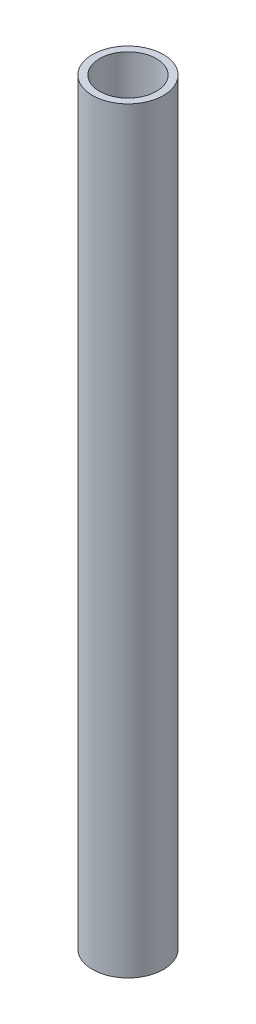
ISO-10303-21;
HEADER;
FILE_DESCRIPTION(('STEP AP214'),'2;1');
FILE_NAME('part.step','',(''),(''),'','','');
FILE_SCHEMA(('AUTOMOTIVE_DESIGN { 1 0 10303 214 1 1 1 1 }'));
ENDSEC;
DATA;
#1=APPLICATION_CONTEXT('core data for automotive mechanical design processes');
#2=APPLICATION_PROTOCOL_DEFINITION('international standard','automotive_design',2000,#1);
#3=PRODUCT_CONTEXT('',#1,'mechanical');
#4=PRODUCT('Part','Part','',(#3));
#5=PRODUCT_RELATED_PRODUCT_CATEGORY('part','',(#4));
#6=PRODUCT_DEFINITION_FORMATION('','',#4);
#7=PRODUCT_DEFINITION_CONTEXT('part definition',#1,'design');
#8=PRODUCT_DEFINITION('design','',#6,#7);
#9=PRODUCT_DEFINITION_SHAPE('','',#8);
#10=(LENGTH_UNIT() NAMED_UNIT(*) SI_UNIT(.MILLI.,.METRE.));
#11=(NAMED_UNIT(*) PLANE_ANGLE_UNIT() SI_UNIT($,.RADIAN.));
#12=(NAMED_UNIT(*) SI_UNIT($,.STERADIAN.) SOLID_ANGLE_UNIT());
#13=UNCERTAINTY_MEASURE_WITH_UNIT(LENGTH_MEASURE(1.E-05),#10,'distance_accuracy_value','');
#14=(GEOMETRIC_REPRESENTATION_CONTEXT(3) GLOBAL_UNCERTAINTY_ASSIGNED_CONTEXT((#13)) GLOBAL_UNIT_ASSIGNED_CONTEXT((#10,
#11,#12)) REPRESENTATION_CONTEXT('',''));
#15=CARTESIAN_POINT('',(0.,0.,0.));
#16=DIRECTION('',(0.,0.,1.));
#17=DIRECTION('',(1.,0.,0.));
#18=AXIS2_PLACEMENT_3D('',#15,#16,#17);
#19=CARTESIAN_POINT('',(0.,320.,0.));
#20=DIRECTION('',(0.,1.,0.));
#21=DIRECTION('',(0.,0.,1.));
#22=AXIS2_PLACEMENT_3D('',#19,#20,#21);
#23=PLANE('',#22);
#24=CARTESIAN_POINT('',(0.,320.,0.));
#25=DIRECTION('',(0.,1.,0.));
#26=DIRECTION('',(0.,0.,1.));
#27=AXIS2_PLACEMENT_3D('',#24,#25,#26);
#28=CIRCLE('',#27,15.);
#29=CARTESIAN_POINT('',(0.,320.,15.));
#30=VERTEX_POINT('',#29);
#31=EDGE_CURVE('E10',#30,#30,#28,.T.);
#32=ORIENTED_EDGE('',*,*,#31,.T.);
#33=EDGE_LOOP('',(#32));
#34=FACE_BOUND('',#33,.T.);
#35=CARTESIAN_POINT('',(0.,320.,0.));
#36=DIRECTION('',(0.,1.,0.));
#37=DIRECTION('',(0.,0.,1.));
#38=AXIS2_PLACEMENT_3D('',#35,#36,#37);
#39=CIRCLE('',#38,12.);
#40=CARTESIAN_POINT('',(0.,320.,12.));
#41=VERTEX_POINT('',#40);
#42=EDGE_CURVE('E42',#41,#41,#39,.T.);
#43=ORIENTED_EDGE('',*,*,#42,.F.);
#44=EDGE_LOOP('',(#43));
#45=FACE_BOUND('',#44,.T.);
#46=ADVANCED_FACE('F31',(#34,#45),#23,.T.);
#47=CARTESIAN_POINT('',(0.,0.,0.));
#48=DIRECTION('',(0.,1.,0.));
#49=DIRECTION('',(0.,0.,1.));
#50=AXIS2_PLACEMENT_3D('',#47,#48,#49);
#51=PLANE('',#50);
#52=CARTESIAN_POINT('',(0.,0.,0.));
#53=DIRECTION('',(0.,1.,0.));
#54=DIRECTION('',(0.,0.,1.));
#55=AXIS2_PLACEMENT_3D('',#52,#53,#54);
#56=CIRCLE('',#55,15.);
#57=CARTESIAN_POINT('',(0.,0.,15.));
#58=VERTEX_POINT('',#57);
#59=EDGE_CURVE('E35',#58,#58,#56,.T.);
#60=ORIENTED_EDGE('',*,*,#59,.F.);
#61=EDGE_LOOP('',(#60));
#62=FACE_BOUND('',#61,.T.);
#63=CARTESIAN_POINT('',(0.,0.,0.));
#64=DIRECTION('',(0.,1.,0.));
#65=DIRECTION('',(0.,0.,1.));
#66=AXIS2_PLACEMENT_3D('',#63,#64,#65);
#67=CIRCLE('',#66,12.);
#68=CARTESIAN_POINT('',(0.,0.,12.));
#69=VERTEX_POINT('',#68);
#70=EDGE_CURVE('E44',#69,#69,#67,.T.);
#71=ORIENTED_EDGE('',*,*,#70,.T.);
#72=EDGE_LOOP('',(#71));
#73=FACE_BOUND('',#72,.T.);
#74=ADVANCED_FACE('F54',(#62,#73),#51,.F.);
#75=CARTESIAN_POINT('',(0.,320.,0.));
#76=DIRECTION('',(0.,-1.,0.));
#77=DIRECTION('',(0.,0.,-1.));
#78=AXIS2_PLACEMENT_3D('',#75,#76,#77);
#79=CYLINDRICAL_SURFACE('',#78,15.);
#80=ORIENTED_EDGE('',*,*,#31,.F.);
#81=EDGE_LOOP('',(#80));
#82=FACE_BOUND('',#81,.T.);
#83=ORIENTED_EDGE('',*,*,#59,.T.);
#84=EDGE_LOOP('',(#83));
#85=FACE_BOUND('',#84,.T.);
#86=ADVANCED_FACE('F33',(#82,#85),#79,.T.);
#87=CARTESIAN_POINT('',(0.,320.,0.));
#88=DIRECTION('',(0.,-1.,0.));
#89=DIRECTION('',(0.,0.,-1.));
#90=AXIS2_PLACEMENT_3D('',#87,#88,#89);
#91=CYLINDRICAL_SURFACE('',#90,12.);
#92=ORIENTED_EDGE('',*,*,#42,.T.);
#93=EDGE_LOOP('',(#92));
#94=FACE_BOUND('',#93,.T.);
#95=ORIENTED_EDGE('',*,*,#70,.F.);
#96=EDGE_LOOP('',(#95));
#97=FACE_BOUND('',#96,.T.);
#98=ADVANCED_FACE('F50',(#94,#97),#91,.F.);
#99=CLOSED_SHELL('',(#46,#74,#86,#98));
#100=MANIFOLD_SOLID_BREP('B2',#99);
#101=ADVANCED_BREP_SHAPE_REPRESENTATION('',(#18,#100),#14);
#102=SHAPE_DEFINITION_REPRESENTATION(#9,#101);
ENDSEC;
END-ISO-10303-21;
